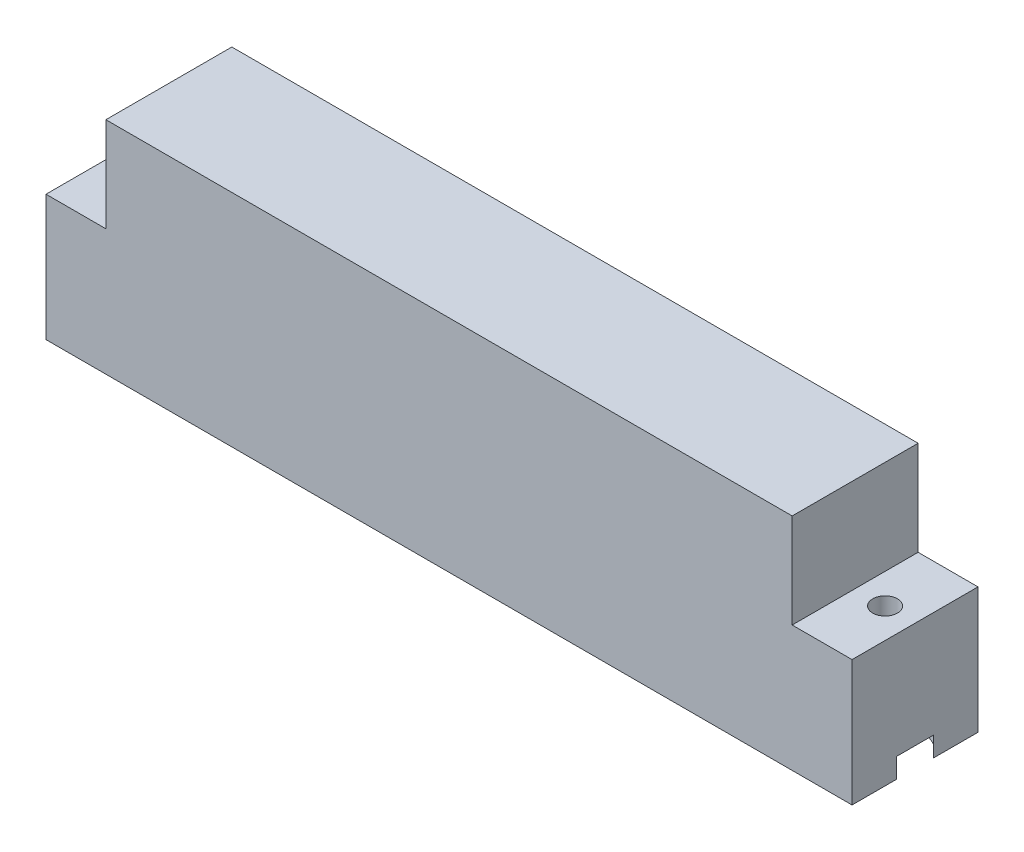
ISO-10303-21;
HEADER;
FILE_DESCRIPTION(('STEP AP214'),'2;1');
FILE_NAME('part.step','',(''),(''),'','','');
FILE_SCHEMA(('AUTOMOTIVE_DESIGN { 1 0 10303 214 1 1 1 1 }'));
ENDSEC;
DATA;
#1=APPLICATION_CONTEXT('core data for automotive mechanical design processes');
#2=APPLICATION_PROTOCOL_DEFINITION('international standard','automotive_design',2000,#1);
#3=PRODUCT_CONTEXT('',#1,'mechanical');
#4=PRODUCT('Part','Part','',(#3));
#5=PRODUCT_RELATED_PRODUCT_CATEGORY('part','',(#4));
#6=PRODUCT_DEFINITION_FORMATION('','',#4);
#7=PRODUCT_DEFINITION_CONTEXT('part definition',#1,'design');
#8=PRODUCT_DEFINITION('design','',#6,#7);
#9=PRODUCT_DEFINITION_SHAPE('','',#8);
#10=(LENGTH_UNIT() NAMED_UNIT(*) SI_UNIT(.MILLI.,.METRE.));
#11=(NAMED_UNIT(*) PLANE_ANGLE_UNIT() SI_UNIT($,.RADIAN.));
#12=(NAMED_UNIT(*) SI_UNIT($,.STERADIAN.) SOLID_ANGLE_UNIT());
#13=UNCERTAINTY_MEASURE_WITH_UNIT(LENGTH_MEASURE(1.E-05),#10,'distance_accuracy_value','');
#14=(GEOMETRIC_REPRESENTATION_CONTEXT(3) GLOBAL_UNCERTAINTY_ASSIGNED_CONTEXT((#13)) GLOBAL_UNIT_ASSIGNED_CONTEXT((#10,
#11,#12)) REPRESENTATION_CONTEXT('',''));
#15=CARTESIAN_POINT('',(0.,0.,0.));
#16=DIRECTION('',(0.,0.,1.));
#17=DIRECTION('',(1.,0.,0.));
#18=AXIS2_PLACEMENT_3D('',#15,#16,#17);
#19=CARTESIAN_POINT('',(78.26121,0.,-6.35));
#20=DIRECTION('',(0.,1.,0.));
#21=DIRECTION('',(0.,0.,1.));
#22=AXIS2_PLACEMENT_3D('',#19,#20,#21);
#23=CYLINDRICAL_SURFACE('',#22,1.25);
#24=CARTESIAN_POINT('',(78.26121,12.7,-6.35));
#25=DIRECTION('',(0.,1.,0.));
#26=DIRECTION('',(0.,0.,1.));
#27=AXIS2_PLACEMENT_3D('',#24,#25,#26);
#28=CIRCLE('',#27,1.25);
#29=CARTESIAN_POINT('',(78.26121,12.7,-5.1));
#30=VERTEX_POINT('',#29);
#31=EDGE_CURVE('E198',#30,#30,#28,.T.);
#32=ORIENTED_EDGE('',*,*,#31,.T.);
#33=EDGE_LOOP('',(#32));
#34=FACE_BOUND('',#33,.T.);
#35=CARTESIAN_POINT('',(78.26121,1.99898,-6.35));
#36=DIRECTION('',(0.,-1.,0.));
#37=DIRECTION('',(0.,0.,-1.));
#38=AXIS2_PLACEMENT_3D('',#35,#36,#37);
#39=CIRCLE('',#38,1.25);
#40=CARTESIAN_POINT('',(78.26121,1.99898,-7.6));
#41=VERTEX_POINT('',#40);
#42=EDGE_CURVE('E41',#41,#41,#39,.F.);
#43=ORIENTED_EDGE('',*,*,#42,.F.);
#44=EDGE_LOOP('',(#43));
#45=FACE_BOUND('',#44,.T.);
#46=ADVANCED_FACE('F37',(#34,#45),#23,.F.);
#47=CARTESIAN_POINT('',(3.01879,0.,-6.35));
#48=DIRECTION('',(0.,1.,0.));
#49=DIRECTION('',(0.,0.,1.));
#50=AXIS2_PLACEMENT_3D('',#47,#48,#49);
#51=CYLINDRICAL_SURFACE('',#50,1.25);
#52=CARTESIAN_POINT('',(3.01879,12.7,-6.35));
#53=DIRECTION('',(0.,1.,0.));
#54=DIRECTION('',(0.,0.,1.));
#55=AXIS2_PLACEMENT_3D('',#52,#53,#54);
#56=CIRCLE('',#55,1.25);
#57=CARTESIAN_POINT('',(3.01879,12.7,-5.1));
#58=VERTEX_POINT('',#57);
#59=EDGE_CURVE('E199',#58,#58,#56,.T.);
#60=ORIENTED_EDGE('',*,*,#59,.T.);
#61=EDGE_LOOP('',(#60));
#62=FACE_BOUND('',#61,.T.);
#63=CARTESIAN_POINT('',(3.01879,1.99898,-6.35));
#64=DIRECTION('',(0.,-1.,0.));
#65=DIRECTION('',(0.,0.,-1.));
#66=AXIS2_PLACEMENT_3D('',#63,#64,#65);
#67=CIRCLE('',#66,1.25);
#68=CARTESIAN_POINT('',(3.01879,1.99898,-7.6));
#69=VERTEX_POINT('',#68);
#70=EDGE_CURVE('E174',#69,#69,#67,.F.);
#71=ORIENTED_EDGE('',*,*,#70,.F.);
#72=EDGE_LOOP('',(#71));
#73=FACE_BOUND('',#72,.T.);
#74=ADVANCED_FACE('F267',(#62,#73),#51,.F.);
#75=CARTESIAN_POINT('',(0.,12.7,0.));
#76=DIRECTION('',(0.,-1.,0.));
#77=DIRECTION('',(0.,0.,-1.));
#78=AXIS2_PLACEMENT_3D('',#75,#76,#77);
#79=PLANE('',#78);
#80=ORIENTED_EDGE('',*,*,#59,.F.);
#81=EDGE_LOOP('',(#80));
#82=FACE_BOUND('',#81,.T.);
#83=DIRECTION('',(0.,0.,1.));
#84=VECTOR('',#83,1.);
#85=CARTESIAN_POINT('',(6.03758,12.7,0.));
#86=LINE('',#85,#84);
#87=CARTESIAN_POINT('',(6.03758,12.7,-12.7));
#88=VERTEX_POINT('',#87);
#89=CARTESIAN_POINT('',(6.03758,12.7,0.));
#90=VERTEX_POINT('',#89);
#91=EDGE_CURVE('E202',#88,#90,#86,.T.);
#92=ORIENTED_EDGE('',*,*,#91,.F.);
#93=DIRECTION('',(-1.,0.,0.));
#94=VECTOR('',#93,1.);
#95=CARTESIAN_POINT('',(0.,12.7,-12.7));
#96=LINE('',#95,#94);
#97=CARTESIAN_POINT('',(0.,12.7,-12.7));
#98=VERTEX_POINT('',#97);
#99=EDGE_CURVE('E232',#88,#98,#96,.T.);
#100=ORIENTED_EDGE('',*,*,#99,.T.);
#101=DIRECTION('',(0.,0.,1.));
#102=VECTOR('',#101,1.);
#103=CARTESIAN_POINT('',(0.,12.7,0.));
#104=LINE('',#103,#102);
#105=CARTESIAN_POINT('',(0.,12.7,0.));
#106=VERTEX_POINT('',#105);
#107=EDGE_CURVE('E166',#98,#106,#104,.T.);
#108=ORIENTED_EDGE('',*,*,#107,.T.);
#109=DIRECTION('',(1.,0.,0.));
#110=VECTOR('',#109,1.);
#111=CARTESIAN_POINT('',(0.,12.7,0.));
#112=LINE('',#111,#110);
#113=EDGE_CURVE('E230',#106,#90,#112,.T.);
#114=ORIENTED_EDGE('',*,*,#113,.T.);
#115=EDGE_LOOP('',(#92,#100,#108,#114));
#116=FACE_BOUND('',#115,.T.);
#117=ADVANCED_FACE('F265',(#82,#116),#79,.F.);
#118=ORIENTED_EDGE('',*,*,#31,.F.);
#119=EDGE_LOOP('',(#118));
#120=FACE_BOUND('',#119,.T.);
#121=DIRECTION('',(0.,0.,-1.));
#122=VECTOR('',#121,1.);
#123=CARTESIAN_POINT('',(75.24242,12.7,0.));
#124=LINE('',#123,#122);
#125=CARTESIAN_POINT('',(75.24242,12.7,0.));
#126=VERTEX_POINT('',#125);
#127=CARTESIAN_POINT('',(75.24242,12.7,-12.7));
#128=VERTEX_POINT('',#127);
#129=EDGE_CURVE('E209',#126,#128,#124,.T.);
#130=ORIENTED_EDGE('',*,*,#129,.F.);
#131=CARTESIAN_POINT('',(81.28,12.7,0.));
#132=VERTEX_POINT('',#131);
#133=EDGE_CURVE('E229',#126,#132,#112,.T.);
#134=ORIENTED_EDGE('',*,*,#133,.T.);
#135=DIRECTION('',(0.,0.,-1.));
#136=VECTOR('',#135,1.);
#137=CARTESIAN_POINT('',(81.28,12.7,0.));
#138=LINE('',#137,#136);
#139=CARTESIAN_POINT('',(81.28,12.7,-12.7));
#140=VERTEX_POINT('',#139);
#141=EDGE_CURVE('E231',#132,#140,#138,.T.);
#142=ORIENTED_EDGE('',*,*,#141,.T.);
#143=EDGE_CURVE('E157',#140,#128,#96,.T.);
#144=ORIENTED_EDGE('',*,*,#143,.T.);
#145=EDGE_LOOP('',(#130,#134,#142,#144));
#146=FACE_BOUND('',#145,.T.);
#147=ADVANCED_FACE('F240',(#120,#146),#79,.F.);
#148=CARTESIAN_POINT('',(0.,12.7,0.));
#149=DIRECTION('',(1.,0.,0.));
#150=DIRECTION('',(0.,0.,-1.));
#151=AXIS2_PLACEMENT_3D('',#148,#149,#150);
#152=PLANE('',#151);
#153=DIRECTION('',(0.,0.,-1.));
#154=VECTOR('',#153,1.);
#155=CARTESIAN_POINT('',(0.,1.99898,0.));
#156=LINE('',#155,#154);
#157=CARTESIAN_POINT('',(0.,1.99898,-4.47062698330002));
#158=VERTEX_POINT('',#157);
#159=CARTESIAN_POINT('',(0.,1.99898,-8.22937301669998));
#160=VERTEX_POINT('',#159);
#161=EDGE_CURVE('E144',#158,#160,#156,.T.);
#162=ORIENTED_EDGE('',*,*,#161,.F.);
#163=DIRECTION('',(0.,-1.,0.));
#164=VECTOR('',#163,1.);
#165=CARTESIAN_POINT('',(0.,1.99898,-4.47062698330002));
#166=LINE('',#165,#164);
#167=CARTESIAN_POINT('',(0.,0.,-4.47062698330002));
#168=VERTEX_POINT('',#167);
#169=EDGE_CURVE('E130',#158,#168,#166,.T.);
#170=ORIENTED_EDGE('',*,*,#169,.T.);
#171=DIRECTION('',(0.,0.,1.));
#172=VECTOR('',#171,1.);
#173=CARTESIAN_POINT('',(0.,0.,0.));
#174=LINE('',#173,#172);
#175=CARTESIAN_POINT('',(0.,0.,0.));
#176=VERTEX_POINT('',#175);
#177=EDGE_CURVE('E142',#168,#176,#174,.T.);
#178=ORIENTED_EDGE('',*,*,#177,.T.);
#179=DIRECTION('',(0.,-1.,0.));
#180=VECTOR('',#179,1.);
#181=CARTESIAN_POINT('',(0.,12.7,0.));
#182=LINE('',#181,#180);
#183=EDGE_CURVE('E11',#106,#176,#182,.T.);
#184=ORIENTED_EDGE('',*,*,#183,.F.);
#185=ORIENTED_EDGE('',*,*,#107,.F.);
#186=DIRECTION('',(0.,-1.,0.));
#187=VECTOR('',#186,1.);
#188=CARTESIAN_POINT('',(0.,12.7,-12.7));
#189=LINE('',#188,#187);
#190=CARTESIAN_POINT('',(0.,0.,-12.7));
#191=VERTEX_POINT('',#190);
#192=EDGE_CURVE('E167',#98,#191,#189,.T.);
#193=ORIENTED_EDGE('',*,*,#192,.T.);
#194=CARTESIAN_POINT('',(0.,0.,-8.22937301669998));
#195=VERTEX_POINT('',#194);
#196=EDGE_CURVE('E149',#191,#195,#174,.T.);
#197=ORIENTED_EDGE('',*,*,#196,.T.);
#198=DIRECTION('',(0.,-1.,0.));
#199=VECTOR('',#198,1.);
#200=CARTESIAN_POINT('',(0.,1.99898,-8.22937301669998));
#201=LINE('',#200,#199);
#202=EDGE_CURVE('E62',#195,#160,#201,.F.);
#203=ORIENTED_EDGE('',*,*,#202,.T.);
#204=EDGE_LOOP('',(#162,#170,#178,#184,#185,#193,#197,#203));
#205=FACE_BOUND('',#204,.T.);
#206=ADVANCED_FACE('F39',(#205),#152,.F.);
#207=CARTESIAN_POINT('',(0.,12.7,0.));
#208=DIRECTION('',(0.,0.,-1.));
#209=DIRECTION('',(-1.,0.,0.));
#210=AXIS2_PLACEMENT_3D('',#207,#208,#209);
#211=PLANE('',#210);
#212=DIRECTION('',(1.,0.,0.));
#213=VECTOR('',#212,1.);
#214=CARTESIAN_POINT('',(0.,0.,0.));
#215=LINE('',#214,#213);
#216=CARTESIAN_POINT('',(81.28,0.,0.));
#217=VERTEX_POINT('',#216);
#218=EDGE_CURVE('E148',#176,#217,#215,.T.);
#219=ORIENTED_EDGE('',*,*,#218,.T.);
#220=DIRECTION('',(0.,-1.,0.));
#221=VECTOR('',#220,1.);
#222=CARTESIAN_POINT('',(81.28,12.7,0.));
#223=LINE('',#222,#221);
#224=EDGE_CURVE('E46',#132,#217,#223,.T.);
#225=ORIENTED_EDGE('',*,*,#224,.F.);
#226=ORIENTED_EDGE('',*,*,#133,.F.);
#227=DIRECTION('',(0.,-1.,0.));
#228=VECTOR('',#227,1.);
#229=CARTESIAN_POINT('',(75.24242,22.225,0.));
#230=LINE('',#229,#228);
#231=CARTESIAN_POINT('',(75.24242,22.225,0.));
#232=VERTEX_POINT('',#231);
#233=EDGE_CURVE('E153',#232,#126,#230,.T.);
#234=ORIENTED_EDGE('',*,*,#233,.F.);
#235=DIRECTION('',(1.,0.,0.));
#236=VECTOR('',#235,1.);
#237=CARTESIAN_POINT('',(6.03758,22.225,0.));
#238=LINE('',#237,#236);
#239=CARTESIAN_POINT('',(6.03758,22.225,0.));
#240=VERTEX_POINT('',#239);
#241=EDGE_CURVE('E208',#240,#232,#238,.T.);
#242=ORIENTED_EDGE('',*,*,#241,.F.);
#243=DIRECTION('',(0.,-1.,0.));
#244=VECTOR('',#243,1.);
#245=CARTESIAN_POINT('',(6.03758,22.225,0.));
#246=LINE('',#245,#244);
#247=EDGE_CURVE('E150',#240,#90,#246,.T.);
#248=ORIENTED_EDGE('',*,*,#247,.T.);
#249=ORIENTED_EDGE('',*,*,#113,.F.);
#250=ORIENTED_EDGE('',*,*,#183,.T.);
#251=EDGE_LOOP('',(#219,#225,#226,#234,#242,#248,#249,#250));
#252=FACE_BOUND('',#251,.T.);
#253=ADVANCED_FACE('F256',(#252),#211,.F.);
#254=CARTESIAN_POINT('',(81.28,12.7,0.));
#255=DIRECTION('',(-1.,0.,0.));
#256=DIRECTION('',(0.,0.,1.));
#257=AXIS2_PLACEMENT_3D('',#254,#255,#256);
#258=PLANE('',#257);
#259=DIRECTION('',(0.,0.,1.));
#260=VECTOR('',#259,1.);
#261=CARTESIAN_POINT('',(81.28,1.99898,0.));
#262=LINE('',#261,#260);
#263=CARTESIAN_POINT('',(81.28,1.99898,-8.22937301669997));
#264=VERTEX_POINT('',#263);
#265=CARTESIAN_POINT('',(81.28,1.99898,-4.47062698330003));
#266=VERTEX_POINT('',#265);
#267=EDGE_CURVE('E191',#264,#266,#262,.T.);
#268=ORIENTED_EDGE('',*,*,#267,.F.);
#269=DIRECTION('',(0.,-1.,0.));
#270=VECTOR('',#269,1.);
#271=CARTESIAN_POINT('',(81.28,1.99898,-8.22937301669997));
#272=LINE('',#271,#270);
#273=CARTESIAN_POINT('',(81.28,0.,-8.22937301669997));
#274=VERTEX_POINT('',#273);
#275=EDGE_CURVE('E195',#264,#274,#272,.T.);
#276=ORIENTED_EDGE('',*,*,#275,.T.);
#277=DIRECTION('',(0.,0.,-1.));
#278=VECTOR('',#277,1.);
#279=CARTESIAN_POINT('',(81.28,0.,0.));
#280=LINE('',#279,#278);
#281=CARTESIAN_POINT('',(81.28,0.,-12.7));
#282=VERTEX_POINT('',#281);
#283=EDGE_CURVE('E160',#274,#282,#280,.T.);
#284=ORIENTED_EDGE('',*,*,#283,.T.);
#285=DIRECTION('',(0.,-1.,0.));
#286=VECTOR('',#285,1.);
#287=CARTESIAN_POINT('',(81.28,12.7,-12.7));
#288=LINE('',#287,#286);
#289=EDGE_CURVE('E170',#140,#282,#288,.T.);
#290=ORIENTED_EDGE('',*,*,#289,.F.);
#291=ORIENTED_EDGE('',*,*,#141,.F.);
#292=ORIENTED_EDGE('',*,*,#224,.T.);
#293=CARTESIAN_POINT('',(81.28,0.,-4.47062698330003));
#294=VERTEX_POINT('',#293);
#295=EDGE_CURVE('E161',#217,#294,#280,.T.);
#296=ORIENTED_EDGE('',*,*,#295,.T.);
#297=DIRECTION('',(0.,-1.,0.));
#298=VECTOR('',#297,1.);
#299=CARTESIAN_POINT('',(81.28,1.99898,-4.47062698330003));
#300=LINE('',#299,#298);
#301=EDGE_CURVE('E54',#294,#266,#300,.F.);
#302=ORIENTED_EDGE('',*,*,#301,.T.);
#303=EDGE_LOOP('',(#268,#276,#284,#290,#291,#292,#296,#302));
#304=FACE_BOUND('',#303,.T.);
#305=ADVANCED_FACE('F259',(#304),#258,.F.);
#306=CARTESIAN_POINT('',(0.,12.7,-12.7));
#307=DIRECTION('',(0.,0.,1.));
#308=DIRECTION('',(1.,0.,0.));
#309=AXIS2_PLACEMENT_3D('',#306,#307,#308);
#310=PLANE('',#309);
#311=CARTESIAN_POINT('',(40.64,13.29944,-12.7));
#312=DIRECTION('',(0.,0.,-1.));
#313=DIRECTION('',(-1.,0.,0.));
#314=AXIS2_PLACEMENT_3D('',#311,#312,#313);
#315=CIRCLE('',#314,2.19964);
#316=CARTESIAN_POINT('',(38.44036,13.29944,-12.7));
#317=VERTEX_POINT('',#316);
#318=EDGE_CURVE('E186',#317,#317,#315,.T.);
#319=ORIENTED_EDGE('',*,*,#318,.F.);
#320=EDGE_LOOP('',(#319));
#321=FACE_BOUND('',#320,.T.);
#322=DIRECTION('',(-1.,0.,0.));
#323=VECTOR('',#322,1.);
#324=CARTESIAN_POINT('',(0.,0.,-12.7));
#325=LINE('',#324,#323);
#326=EDGE_CURVE('E164',#282,#191,#325,.T.);
#327=ORIENTED_EDGE('',*,*,#326,.T.);
#328=ORIENTED_EDGE('',*,*,#192,.F.);
#329=ORIENTED_EDGE('',*,*,#99,.F.);
#330=DIRECTION('',(0.,-1.,0.));
#331=VECTOR('',#330,1.);
#332=CARTESIAN_POINT('',(6.03758,22.225,-12.7));
#333=LINE('',#332,#331);
#334=CARTESIAN_POINT('',(6.03758,22.225,-12.7));
#335=VERTEX_POINT('',#334);
#336=EDGE_CURVE('E215',#335,#88,#333,.T.);
#337=ORIENTED_EDGE('',*,*,#336,.F.);
#338=DIRECTION('',(-1.,0.,0.));
#339=VECTOR('',#338,1.);
#340=CARTESIAN_POINT('',(6.03758,22.225,-12.7));
#341=LINE('',#340,#339);
#342=CARTESIAN_POINT('',(75.24242,22.225,-12.7));
#343=VERTEX_POINT('',#342);
#344=EDGE_CURVE('E213',#343,#335,#341,.T.);
#345=ORIENTED_EDGE('',*,*,#344,.F.);
#346=DIRECTION('',(0.,-1.,0.));
#347=VECTOR('',#346,1.);
#348=CARTESIAN_POINT('',(75.24242,22.225,-12.7));
#349=LINE('',#348,#347);
#350=EDGE_CURVE('E222',#343,#128,#349,.T.);
#351=ORIENTED_EDGE('',*,*,#350,.T.);
#352=ORIENTED_EDGE('',*,*,#143,.F.);
#353=ORIENTED_EDGE('',*,*,#289,.T.);
#354=EDGE_LOOP('',(#327,#328,#329,#337,#345,#351,#352,#353));
#355=FACE_BOUND('',#354,.T.);
#356=ADVANCED_FACE('F249',(#321,#355),#310,.F.);
#357=CARTESIAN_POINT('',(0.,0.,0.));
#358=DIRECTION('',(0.,-1.,0.));
#359=DIRECTION('',(0.,0.,-1.));
#360=AXIS2_PLACEMENT_3D('',#357,#358,#359);
#361=PLANE('',#360);
#362=CARTESIAN_POINT('',(78.26121,0.,-6.35));
#363=DIRECTION('',(0.,-1.,0.));
#364=DIRECTION('',(0.,0.,-1.));
#365=AXIS2_PLACEMENT_3D('',#362,#363,#364);
#366=CIRCLE('',#365,3.556);
#367=EDGE_CURVE('E136',#294,#274,#366,.T.);
#368=ORIENTED_EDGE('',*,*,#367,.F.);
#369=ORIENTED_EDGE('',*,*,#295,.F.);
#370=ORIENTED_EDGE('',*,*,#218,.F.);
#371=ORIENTED_EDGE('',*,*,#177,.F.);
#372=CARTESIAN_POINT('',(3.01879,0.,-6.35));
#373=DIRECTION('',(0.,-1.,0.));
#374=DIRECTION('',(0.,0.,-1.));
#375=AXIS2_PLACEMENT_3D('',#372,#373,#374);
#376=CIRCLE('',#375,3.556);
#377=EDGE_CURVE('E127',#195,#168,#376,.T.);
#378=ORIENTED_EDGE('',*,*,#377,.F.);
#379=ORIENTED_EDGE('',*,*,#196,.F.);
#380=ORIENTED_EDGE('',*,*,#326,.F.);
#381=ORIENTED_EDGE('',*,*,#283,.F.);
#382=EDGE_LOOP('',(#368,#369,#370,#371,#378,#379,#380,#381));
#383=FACE_BOUND('',#382,.T.);
#384=ADVANCED_FACE('F146',(#383),#361,.T.);
#385=CARTESIAN_POINT('',(6.03758,22.225,0.));
#386=DIRECTION('',(1.,0.,0.));
#387=DIRECTION('',(0.,0.,-1.));
#388=AXIS2_PLACEMENT_3D('',#385,#386,#387);
#389=PLANE('',#388);
#390=ORIENTED_EDGE('',*,*,#91,.T.);
#391=ORIENTED_EDGE('',*,*,#247,.F.);
#392=DIRECTION('',(0.,0.,1.));
#393=VECTOR('',#392,1.);
#394=CARTESIAN_POINT('',(6.03758,22.225,0.));
#395=LINE('',#394,#393);
#396=EDGE_CURVE('E205',#335,#240,#395,.T.);
#397=ORIENTED_EDGE('',*,*,#396,.F.);
#398=ORIENTED_EDGE('',*,*,#336,.T.);
#399=EDGE_LOOP('',(#390,#391,#397,#398));
#400=FACE_BOUND('',#399,.T.);
#401=ADVANCED_FACE('F264',(#400),#389,.F.);
#402=CARTESIAN_POINT('',(75.24242,22.225,0.));
#403=DIRECTION('',(-1.,0.,0.));
#404=DIRECTION('',(0.,0.,1.));
#405=AXIS2_PLACEMENT_3D('',#402,#403,#404);
#406=PLANE('',#405);
#407=ORIENTED_EDGE('',*,*,#129,.T.);
#408=ORIENTED_EDGE('',*,*,#350,.F.);
#409=DIRECTION('',(0.,0.,-1.));
#410=VECTOR('',#409,1.);
#411=CARTESIAN_POINT('',(75.24242,22.225,0.));
#412=LINE('',#411,#410);
#413=EDGE_CURVE('E211',#232,#343,#412,.T.);
#414=ORIENTED_EDGE('',*,*,#413,.F.);
#415=ORIENTED_EDGE('',*,*,#233,.T.);
#416=EDGE_LOOP('',(#407,#408,#414,#415));
#417=FACE_BOUND('',#416,.T.);
#418=ADVANCED_FACE('F245',(#417),#406,.F.);
#419=CARTESIAN_POINT('',(0.,22.225,0.));
#420=DIRECTION('',(0.,-1.,0.));
#421=DIRECTION('',(0.,0.,-1.));
#422=AXIS2_PLACEMENT_3D('',#419,#420,#421);
#423=PLANE('',#422);
#424=ORIENTED_EDGE('',*,*,#396,.T.);
#425=ORIENTED_EDGE('',*,*,#241,.T.);
#426=ORIENTED_EDGE('',*,*,#413,.T.);
#427=ORIENTED_EDGE('',*,*,#344,.T.);
#428=EDGE_LOOP('',(#424,#425,#426,#427));
#429=FACE_BOUND('',#428,.T.);
#430=ADVANCED_FACE('F253',(#429),#423,.F.);
#431=CARTESIAN_POINT('',(3.01879,1.99898,-6.35));
#432=DIRECTION('',(0.,-1.,0.));
#433=DIRECTION('',(0.,0.,-1.));
#434=AXIS2_PLACEMENT_3D('',#431,#432,#433);
#435=CYLINDRICAL_SURFACE('',#434,3.556);
#436=CARTESIAN_POINT('',(3.01879,1.99898,-6.35));
#437=DIRECTION('',(0.,-1.,0.));
#438=DIRECTION('',(0.,0.,-1.));
#439=AXIS2_PLACEMENT_3D('',#436,#437,#438);
#440=CIRCLE('',#439,3.556);
#441=EDGE_CURVE('E137',#160,#158,#440,.T.);
#442=ORIENTED_EDGE('',*,*,#441,.F.);
#443=ORIENTED_EDGE('',*,*,#202,.F.);
#444=ORIENTED_EDGE('',*,*,#377,.T.);
#445=ORIENTED_EDGE('',*,*,#169,.F.);
#446=EDGE_LOOP('',(#442,#443,#444,#445));
#447=FACE_BOUND('',#446,.T.);
#448=ADVANCED_FACE('F129',(#447),#435,.F.);
#449=CARTESIAN_POINT('',(3.01879,1.99898,-6.35));
#450=DIRECTION('',(0.,-1.,0.));
#451=DIRECTION('',(0.,0.,-1.));
#452=AXIS2_PLACEMENT_3D('',#449,#450,#451);
#453=PLANE('',#452);
#454=ORIENTED_EDGE('',*,*,#70,.T.);
#455=EDGE_LOOP('',(#454));
#456=FACE_BOUND('',#455,.T.);
#457=ORIENTED_EDGE('',*,*,#161,.T.);
#458=ORIENTED_EDGE('',*,*,#441,.T.);
#459=EDGE_LOOP('',(#457,#458));
#460=FACE_BOUND('',#459,.T.);
#461=ADVANCED_FACE('F442',(#456,#460),#453,.T.);
#462=CARTESIAN_POINT('',(78.26121,1.99898,-6.35));
#463=DIRECTION('',(0.,-1.,0.));
#464=DIRECTION('',(0.,0.,-1.));
#465=AXIS2_PLACEMENT_3D('',#462,#463,#464);
#466=CYLINDRICAL_SURFACE('',#465,3.556);
#467=CARTESIAN_POINT('',(78.26121,1.99898,-6.35));
#468=DIRECTION('',(0.,-1.,0.));
#469=DIRECTION('',(0.,0.,-1.));
#470=AXIS2_PLACEMENT_3D('',#467,#468,#469);
#471=CIRCLE('',#470,3.556);
#472=EDGE_CURVE('E176',#266,#264,#471,.T.);
#473=ORIENTED_EDGE('',*,*,#472,.F.);
#474=ORIENTED_EDGE('',*,*,#301,.F.);
#475=ORIENTED_EDGE('',*,*,#367,.T.);
#476=ORIENTED_EDGE('',*,*,#275,.F.);
#477=EDGE_LOOP('',(#473,#474,#475,#476));
#478=FACE_BOUND('',#477,.T.);
#479=ADVANCED_FACE('F433',(#478),#466,.F.);
#480=CARTESIAN_POINT('',(78.26121,1.99898,-6.35));
#481=DIRECTION('',(0.,-1.,0.));
#482=DIRECTION('',(0.,0.,-1.));
#483=AXIS2_PLACEMENT_3D('',#480,#481,#482);
#484=PLANE('',#483);
#485=ORIENTED_EDGE('',*,*,#42,.T.);
#486=EDGE_LOOP('',(#485));
#487=FACE_BOUND('',#486,.T.);
#488=ORIENTED_EDGE('',*,*,#267,.T.);
#489=ORIENTED_EDGE('',*,*,#472,.T.);
#490=EDGE_LOOP('',(#488,#489));
#491=FACE_BOUND('',#490,.T.);
#492=ADVANCED_FACE('F378',(#487,#491),#484,.T.);
#493=CARTESIAN_POINT('',(40.64,13.29944,-11.43));
#494=DIRECTION('',(0.,0.,-1.));
#495=DIRECTION('',(-1.,0.,0.));
#496=AXIS2_PLACEMENT_3D('',#493,#494,#495);
#497=CYLINDRICAL_SURFACE('',#496,2.19964);
#498=CARTESIAN_POINT('',(40.64,13.29944,-11.43));
#499=DIRECTION('',(0.,0.,-1.));
#500=DIRECTION('',(-1.,0.,0.));
#501=AXIS2_PLACEMENT_3D('',#498,#499,#500);
#502=CIRCLE('',#501,2.19964);
#503=CARTESIAN_POINT('',(38.44036,13.29944,-11.43));
#504=VERTEX_POINT('',#503);
#505=EDGE_CURVE('E189',#504,#504,#502,.T.);
#506=ORIENTED_EDGE('',*,*,#505,.F.);
#507=EDGE_LOOP('',(#506));
#508=FACE_BOUND('',#507,.T.);
#509=ORIENTED_EDGE('',*,*,#318,.T.);
#510=EDGE_LOOP('',(#509));
#511=FACE_BOUND('',#510,.T.);
#512=ADVANCED_FACE('F383',(#508,#511),#497,.F.);
#513=CARTESIAN_POINT('',(40.64,13.29944,-11.43));
#514=DIRECTION('',(0.,0.,-1.));
#515=DIRECTION('',(-1.,0.,0.));
#516=AXIS2_PLACEMENT_3D('',#513,#514,#515);
#517=PLANE('',#516);
#518=CARTESIAN_POINT('',(40.64,13.29944,-11.43));
#519=DIRECTION('',(0.,0.,-1.));
#520=DIRECTION('',(-1.,0.,0.));
#521=AXIS2_PLACEMENT_3D('',#518,#519,#520);
#522=CIRCLE('',#521,1.650000002);
#523=CARTESIAN_POINT('',(38.989999998,13.29944,-11.43));
#524=VERTEX_POINT('',#523);
#525=EDGE_CURVE('E495',#524,#524,#522,.T.);
#526=ORIENTED_EDGE('',*,*,#525,.F.);
#527=EDGE_LOOP('',(#526));
#528=FACE_BOUND('',#527,.T.);
#529=ORIENTED_EDGE('',*,*,#505,.T.);
#530=EDGE_LOOP('',(#529));
#531=FACE_BOUND('',#530,.T.);
#532=ADVANCED_FACE('F388',(#528,#531),#517,.T.);
#533=CARTESIAN_POINT('',(40.64,13.29944,-4.826));
#534=DIRECTION('',(0.,0.,-1.));
#535=DIRECTION('',(-1.,0.,0.));
#536=AXIS2_PLACEMENT_3D('',#533,#534,#535);
#537=CYLINDRICAL_SURFACE('',#536,1.650000002);
#538=CARTESIAN_POINT('',(40.64,13.29944,-4.826));
#539=DIRECTION('',(0.,0.,-1.));
#540=DIRECTION('',(-1.,0.,0.));
#541=AXIS2_PLACEMENT_3D('',#538,#539,#540);
#542=CIRCLE('',#541,1.650000002);
#543=CARTESIAN_POINT('',(38.989999998,13.29944,-4.826));
#544=VERTEX_POINT('',#543);
#545=EDGE_CURVE('E494',#544,#544,#542,.T.);
#546=CARTESIAN_POINT('',(38.989999998,13.29944,-4.826));
#547=CARTESIAN_POINT('',(38.989999998,13.29944,-4.89479166666667));
#548=CARTESIAN_POINT('',(38.989999998,13.29944,-4.96358333333333));
#549=CARTESIAN_POINT('',(38.989999998,13.29944,-5.10116666666667));
#550=CARTESIAN_POINT('',(38.989999998,13.29944,-5.16995833333333));
#551=CARTESIAN_POINT('',(38.989999998,13.29944,-5.30754166666667));
#552=CARTESIAN_POINT('',(38.989999998,13.29944,-5.37633333333333));
#553=CARTESIAN_POINT('',(38.989999998,13.29944,-5.51391666666667));
#554=CARTESIAN_POINT('',(38.989999998,13.29944,-5.58270833333333));
#555=CARTESIAN_POINT('',(38.989999998,13.29944,-5.72029166666667));
#556=CARTESIAN_POINT('',(38.989999998,13.29944,-5.78908333333333));
#557=CARTESIAN_POINT('',(38.989999998,13.29944,-5.92666666666666));
#558=CARTESIAN_POINT('',(38.989999998,13.29944,-5.99545833333333));
#559=CARTESIAN_POINT('',(38.989999998,13.29944,-6.13304166666667));
#560=CARTESIAN_POINT('',(38.989999998,13.29944,-6.20183333333333));
#561=CARTESIAN_POINT('',(38.989999998,13.29944,-6.33941666666666));
#562=CARTESIAN_POINT('',(38.989999998,13.29944,-6.40820833333333));
#563=CARTESIAN_POINT('',(38.989999998,13.29944,-6.54579166666667));
#564=CARTESIAN_POINT('',(38.989999998,13.29944,-6.61458333333333));
#565=CARTESIAN_POINT('',(38.989999998,13.29944,-6.75216666666666));
#566=CARTESIAN_POINT('',(38.989999998,13.29944,-6.82095833333333));
#567=CARTESIAN_POINT('',(38.989999998,13.29944,-6.95854166666667));
#568=CARTESIAN_POINT('',(38.989999998,13.29944,-7.02733333333333));
#569=CARTESIAN_POINT('',(38.989999998,13.29944,-7.16491666666666));
#570=CARTESIAN_POINT('',(38.989999998,13.29944,-7.23370833333333));
#571=CARTESIAN_POINT('',(38.989999998,13.29944,-7.37129166666667));
#572=CARTESIAN_POINT('',(38.989999998,13.29944,-7.44008333333333));
#573=CARTESIAN_POINT('',(38.989999998,13.29944,-7.57766666666666));
#574=CARTESIAN_POINT('',(38.989999998,13.29944,-7.64645833333333));
#575=CARTESIAN_POINT('',(38.989999998,13.29944,-7.78404166666667));
#576=CARTESIAN_POINT('',(38.989999998,13.29944,-7.85283333333333));
#577=CARTESIAN_POINT('',(38.989999998,13.29944,-7.99041666666666));
#578=CARTESIAN_POINT('',(38.989999998,13.29944,-8.05920833333333));
#579=CARTESIAN_POINT('',(38.989999998,13.29944,-8.19679166666666));
#580=CARTESIAN_POINT('',(38.989999998,13.29944,-8.26558333333333));
#581=CARTESIAN_POINT('',(38.989999998,13.29944,-8.40316666666667));
#582=CARTESIAN_POINT('',(38.989999998,13.29944,-8.47195833333333));
#583=CARTESIAN_POINT('',(38.989999998,13.29944,-8.60954166666667));
#584=CARTESIAN_POINT('',(38.989999998,13.29944,-8.67833333333333));
#585=CARTESIAN_POINT('',(38.989999998,13.29944,-8.81591666666666));
#586=CARTESIAN_POINT('',(38.989999998,13.29944,-8.88470833333333));
#587=CARTESIAN_POINT('',(38.989999998,13.29944,-9.02229166666666));
#588=CARTESIAN_POINT('',(38.989999998,13.29944,-9.09108333333333));
#589=CARTESIAN_POINT('',(38.989999998,13.29944,-9.22866666666666));
#590=CARTESIAN_POINT('',(38.989999998,13.29944,-9.29745833333333));
#591=CARTESIAN_POINT('',(38.989999998,13.29944,-9.43504166666666));
#592=CARTESIAN_POINT('',(38.989999998,13.29944,-9.50383333333333));
#593=CARTESIAN_POINT('',(38.989999998,13.29944,-9.64141666666666));
#594=CARTESIAN_POINT('',(38.989999998,13.29944,-9.71020833333333));
#595=CARTESIAN_POINT('',(38.989999998,13.29944,-9.84779166666666));
#596=CARTESIAN_POINT('',(38.989999998,13.29944,-9.91658333333333));
#597=CARTESIAN_POINT('',(38.989999998,13.29944,-10.0541666666667));
#598=CARTESIAN_POINT('',(38.989999998,13.29944,-10.1229583333333));
#599=CARTESIAN_POINT('',(38.989999998,13.29944,-10.2605416666667));
#600=CARTESIAN_POINT('',(38.989999998,13.29944,-10.3293333333333));
#601=CARTESIAN_POINT('',(38.989999998,13.29944,-10.4669166666667));
#602=CARTESIAN_POINT('',(38.989999998,13.29944,-10.5357083333333));
#603=CARTESIAN_POINT('',(38.989999998,13.29944,-10.6732916666667));
#604=CARTESIAN_POINT('',(38.989999998,13.29944,-10.7420833333333));
#605=CARTESIAN_POINT('',(38.989999998,13.29944,-10.8796666666667));
#606=CARTESIAN_POINT('',(38.989999998,13.29944,-10.9484583333333));
#607=CARTESIAN_POINT('',(38.989999998,13.29944,-11.0860416666667));
#608=CARTESIAN_POINT('',(38.989999998,13.29944,-11.1548333333333));
#609=CARTESIAN_POINT('',(38.989999998,13.29944,-11.2924166666667));
#610=CARTESIAN_POINT('',(38.989999998,13.29944,-11.3612083333333));
#611=CARTESIAN_POINT('',(38.989999998,13.29944,-11.43));
#612=B_SPLINE_CURVE_WITH_KNOTS('',3,(#546,#547,#548,#549,#550,#551,#552,#553,#554,#555,#556,
#557,#558,#559,#560,#561,#562,#563,#564,#565,#566,#567,#568,#569,#570,#571,#572,#573,#574,#575,
#576,#577,#578,#579,#580,#581,#582,#583,#584,#585,#586,#587,#588,#589,#590,#591,#592,#593,#594,
#595,#596,#597,#598,#599,#600,#601,#602,#603,#604,#605,#606,#607,#608,#609,#610,#611),
.UNSPECIFIED.,.F.,.F.,(4,2,2,2,2,2,2,2,2,2,2,2,2,2,2,2,2,2,2,2,2,2,2,2,2,2,2,2,2,2,2,2,4),(0.,
0.206374999999999,0.412749999999999,0.619124999999999,0.825499999999999,1.031875,1.23825,
1.444625,1.651,1.857375,2.06375,2.270125,2.4765,2.682875,2.88925,3.095625,3.302,3.508375,
3.71475,3.921125,4.1275,4.333875,4.54025,4.746625,4.953,5.159375,5.36575,5.572125,5.7785,
5.984875,6.19125,6.397625,6.604),.UNSPECIFIED.);
#613=EDGE_CURVE('BSEAM399',#544,#524,#612,.T.);
#614=ORIENTED_EDGE('',*,*,#545,.F.);
#615=ORIENTED_EDGE('',*,*,#525,.T.);
#616=ORIENTED_EDGE('',*,*,#613,.T.);
#617=ORIENTED_EDGE('',*,*,#613,.F.);
#618=EDGE_LOOP('',(#614,#616,#615,#617));
#619=FACE_BOUND('',#618,.T.);
#620=ADVANCED_FACE('F399',(#619),#537,.F.);
#621=CARTESIAN_POINT('',(40.64,13.29944,-4.826));
#622=DIRECTION('',(0.,0.,-1.));
#623=DIRECTION('',(-1.,0.,0.));
#624=AXIS2_PLACEMENT_3D('',#621,#622,#623);
#625=PLANE('',#624);
#626=ORIENTED_EDGE('',*,*,#545,.T.);
#627=EDGE_LOOP('',(#626));
#628=FACE_BOUND('',#627,.T.);
#629=ADVANCED_FACE('F410',(#628),#625,.T.);
#630=CLOSED_SHELL('',(#46,#74,#117,#147,#206,#253,#305,#356,#384,#401,#418,#430,#448,#461,#479,
#492,#512,#532,#620,#629));
#631=MANIFOLD_SOLID_BREP('B2',#630);
#632=ADVANCED_BREP_SHAPE_REPRESENTATION('',(#18,#631),#14);
#633=SHAPE_DEFINITION_REPRESENTATION(#9,#632);
ENDSEC;
END-ISO-10303-21;
